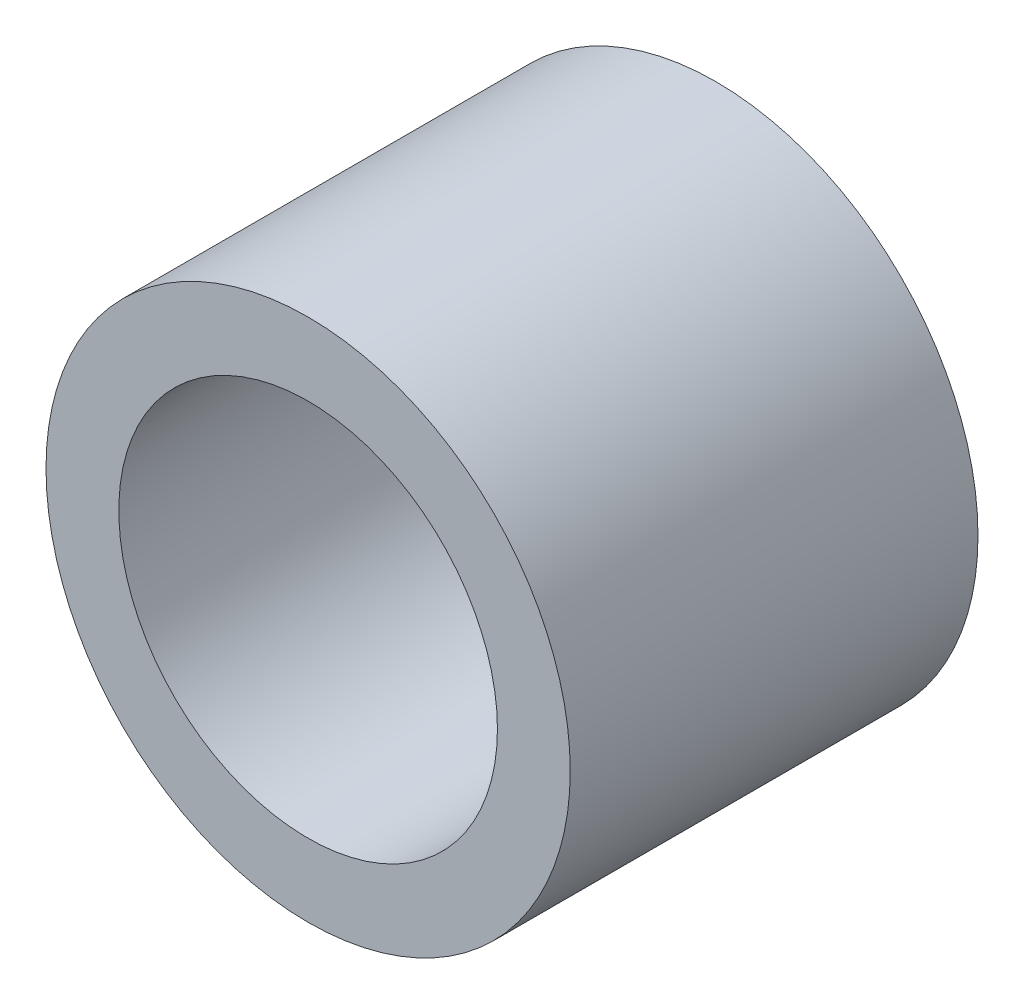
ISO-10303-21;
HEADER;
FILE_DESCRIPTION(('STEP AP214'),'2;1');
FILE_NAME('part.step','',(''),(''),'','','');
FILE_SCHEMA(('AUTOMOTIVE_DESIGN { 1 0 10303 214 1 1 1 1 }'));
ENDSEC;
DATA;
#1=APPLICATION_CONTEXT('core data for automotive mechanical design processes');
#2=APPLICATION_PROTOCOL_DEFINITION('international standard','automotive_design',2000,#1);
#3=PRODUCT_CONTEXT('',#1,'mechanical');
#4=PRODUCT('Part','Part','',(#3));
#5=PRODUCT_RELATED_PRODUCT_CATEGORY('part','',(#4));
#6=PRODUCT_DEFINITION_FORMATION('','',#4);
#7=PRODUCT_DEFINITION_CONTEXT('part definition',#1,'design');
#8=PRODUCT_DEFINITION('design','',#6,#7);
#9=PRODUCT_DEFINITION_SHAPE('','',#8);
#10=(LENGTH_UNIT() NAMED_UNIT(*) SI_UNIT(.MILLI.,.METRE.));
#11=(NAMED_UNIT(*) PLANE_ANGLE_UNIT() SI_UNIT($,.RADIAN.));
#12=(NAMED_UNIT(*) SI_UNIT($,.STERADIAN.) SOLID_ANGLE_UNIT());
#13=UNCERTAINTY_MEASURE_WITH_UNIT(LENGTH_MEASURE(1.E-05),#10,'distance_accuracy_value','');
#14=(GEOMETRIC_REPRESENTATION_CONTEXT(3) GLOBAL_UNCERTAINTY_ASSIGNED_CONTEXT((#13)) GLOBAL_UNIT_ASSIGNED_CONTEXT((#10,
#11,#12)) REPRESENTATION_CONTEXT('',''));
#15=CARTESIAN_POINT('',(0.,0.,0.));
#16=DIRECTION('',(0.,0.,1.));
#17=DIRECTION('',(1.,0.,0.));
#18=AXIS2_PLACEMENT_3D('',#15,#16,#17);
#19=CARTESIAN_POINT('',(0.,0.,7.));
#20=DIRECTION('',(0.,0.,1.));
#21=DIRECTION('',(1.,0.,0.));
#22=AXIS2_PLACEMENT_3D('',#19,#20,#21);
#23=PLANE('',#22);
#24=CARTESIAN_POINT('',(0.,0.,7.));
#25=DIRECTION('',(0.,0.,1.));
#26=DIRECTION('',(1.,0.,0.));
#27=AXIS2_PLACEMENT_3D('',#24,#25,#26);
#28=CIRCLE('',#27,4.5);
#29=CARTESIAN_POINT('',(4.5,0.,7.));
#30=VERTEX_POINT('',#29);
#31=EDGE_CURVE('E10',#30,#30,#28,.T.);
#32=ORIENTED_EDGE('',*,*,#31,.T.);
#33=EDGE_LOOP('',(#32));
#34=FACE_BOUND('',#33,.T.);
#35=CARTESIAN_POINT('',(0.,0.,7.));
#36=DIRECTION('',(0.,0.,1.));
#37=DIRECTION('',(1.,0.,0.));
#38=AXIS2_PLACEMENT_3D('',#35,#36,#37);
#39=CIRCLE('',#38,3.25);
#40=CARTESIAN_POINT('',(3.25,0.,7.));
#41=VERTEX_POINT('',#40);
#42=EDGE_CURVE('E42',#41,#41,#39,.T.);
#43=ORIENTED_EDGE('',*,*,#42,.F.);
#44=EDGE_LOOP('',(#43));
#45=FACE_BOUND('',#44,.T.);
#46=ADVANCED_FACE('F31',(#34,#45),#23,.T.);
#47=CARTESIAN_POINT('',(0.,0.,0.));
#48=DIRECTION('',(0.,0.,1.));
#49=DIRECTION('',(1.,0.,0.));
#50=AXIS2_PLACEMENT_3D('',#47,#48,#49);
#51=PLANE('',#50);
#52=CARTESIAN_POINT('',(0.,0.,0.));
#53=DIRECTION('',(0.,0.,1.));
#54=DIRECTION('',(1.,0.,0.));
#55=AXIS2_PLACEMENT_3D('',#52,#53,#54);
#56=CIRCLE('',#55,4.5);
#57=CARTESIAN_POINT('',(4.5,0.,0.));
#58=VERTEX_POINT('',#57);
#59=EDGE_CURVE('E35',#58,#58,#56,.T.);
#60=ORIENTED_EDGE('',*,*,#59,.F.);
#61=EDGE_LOOP('',(#60));
#62=FACE_BOUND('',#61,.T.);
#63=CARTESIAN_POINT('',(0.,0.,0.));
#64=DIRECTION('',(0.,0.,1.));
#65=DIRECTION('',(1.,0.,0.));
#66=AXIS2_PLACEMENT_3D('',#63,#64,#65);
#67=CIRCLE('',#66,3.25);
#68=CARTESIAN_POINT('',(3.25,0.,0.));
#69=VERTEX_POINT('',#68);
#70=EDGE_CURVE('E44',#69,#69,#67,.T.);
#71=ORIENTED_EDGE('',*,*,#70,.T.);
#72=EDGE_LOOP('',(#71));
#73=FACE_BOUND('',#72,.T.);
#74=ADVANCED_FACE('F54',(#62,#73),#51,.F.);
#75=CARTESIAN_POINT('',(0.,0.,7.));
#76=DIRECTION('',(0.,0.,-1.));
#77=DIRECTION('',(-1.,0.,0.));
#78=AXIS2_PLACEMENT_3D('',#75,#76,#77);
#79=CYLINDRICAL_SURFACE('',#78,4.5);
#80=ORIENTED_EDGE('',*,*,#31,.F.);
#81=EDGE_LOOP('',(#80));
#82=FACE_BOUND('',#81,.T.);
#83=ORIENTED_EDGE('',*,*,#59,.T.);
#84=EDGE_LOOP('',(#83));
#85=FACE_BOUND('',#84,.T.);
#86=ADVANCED_FACE('F33',(#82,#85),#79,.T.);
#87=CARTESIAN_POINT('',(0.,0.,7.));
#88=DIRECTION('',(0.,0.,-1.));
#89=DIRECTION('',(-1.,0.,0.));
#90=AXIS2_PLACEMENT_3D('',#87,#88,#89);
#91=CYLINDRICAL_SURFACE('',#90,3.25);
#92=ORIENTED_EDGE('',*,*,#42,.T.);
#93=EDGE_LOOP('',(#92));
#94=FACE_BOUND('',#93,.T.);
#95=ORIENTED_EDGE('',*,*,#70,.F.);
#96=EDGE_LOOP('',(#95));
#97=FACE_BOUND('',#96,.T.);
#98=ADVANCED_FACE('F50',(#94,#97),#91,.F.);
#99=CLOSED_SHELL('',(#46,#74,#86,#98));
#100=MANIFOLD_SOLID_BREP('B2',#99);
#101=ADVANCED_BREP_SHAPE_REPRESENTATION('',(#18,#100),#14);
#102=SHAPE_DEFINITION_REPRESENTATION(#9,#101);
ENDSEC;
END-ISO-10303-21;
